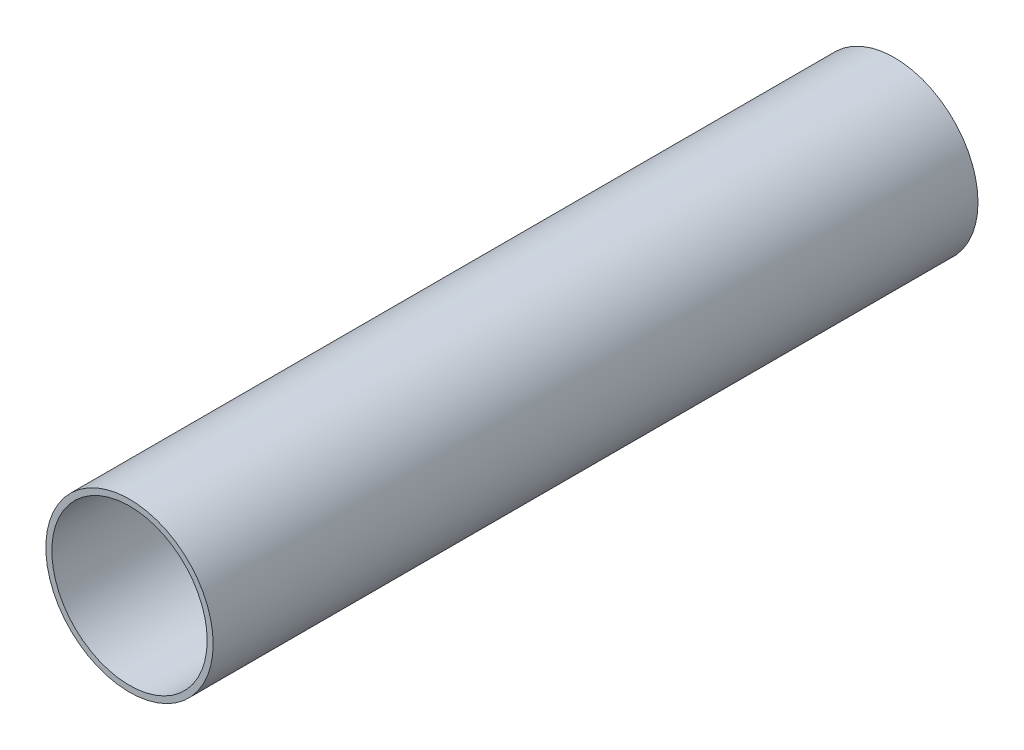
ISO-10303-21;
HEADER;
FILE_DESCRIPTION(('STEP AP214'),'2;1');
FILE_NAME('part.step','',(''),(''),'','','');
FILE_SCHEMA(('AUTOMOTIVE_DESIGN { 1 0 10303 214 1 1 1 1 }'));
ENDSEC;
DATA;
#1=APPLICATION_CONTEXT('core data for automotive mechanical design processes');
#2=APPLICATION_PROTOCOL_DEFINITION('international standard','automotive_design',2000,#1);
#3=PRODUCT_CONTEXT('',#1,'mechanical');
#4=PRODUCT('Part','Part','',(#3));
#5=PRODUCT_RELATED_PRODUCT_CATEGORY('part','',(#4));
#6=PRODUCT_DEFINITION_FORMATION('','',#4);
#7=PRODUCT_DEFINITION_CONTEXT('part definition',#1,'design');
#8=PRODUCT_DEFINITION('design','',#6,#7);
#9=PRODUCT_DEFINITION_SHAPE('','',#8);
#10=(LENGTH_UNIT() NAMED_UNIT(*) SI_UNIT(.MILLI.,.METRE.));
#11=(NAMED_UNIT(*) PLANE_ANGLE_UNIT() SI_UNIT($,.RADIAN.));
#12=(NAMED_UNIT(*) SI_UNIT($,.STERADIAN.) SOLID_ANGLE_UNIT());
#13=UNCERTAINTY_MEASURE_WITH_UNIT(LENGTH_MEASURE(1.E-05),#10,'distance_accuracy_value','');
#14=(GEOMETRIC_REPRESENTATION_CONTEXT(3) GLOBAL_UNCERTAINTY_ASSIGNED_CONTEXT((#13)) GLOBAL_UNIT_ASSIGNED_CONTEXT((#10,
#11,#12)) REPRESENTATION_CONTEXT('',''));
#15=CARTESIAN_POINT('',(0.,0.,0.));
#16=DIRECTION('',(0.,0.,1.));
#17=DIRECTION('',(1.,0.,0.));
#18=AXIS2_PLACEMENT_3D('',#15,#16,#17);
#19=CARTESIAN_POINT('',(0.,0.,168.656));
#20=DIRECTION('',(0.,0.,1.));
#21=DIRECTION('',(1.,0.,0.));
#22=AXIS2_PLACEMENT_3D('',#19,#20,#21);
#23=PLANE('',#22);
#24=CARTESIAN_POINT('',(0.,0.,168.656));
#25=DIRECTION('',(0.,0.,1.));
#26=DIRECTION('',(1.,0.,0.));
#27=AXIS2_PLACEMENT_3D('',#24,#25,#26);
#28=CIRCLE('',#27,14.6685);
#29=CARTESIAN_POINT('',(14.6685,0.,168.656));
#30=VERTEX_POINT('',#29);
#31=EDGE_CURVE('E10',#30,#30,#28,.T.);
#32=ORIENTED_EDGE('',*,*,#31,.T.);
#33=EDGE_LOOP('',(#32));
#34=FACE_BOUND('',#33,.T.);
#35=CARTESIAN_POINT('',(0.,0.,168.656));
#36=DIRECTION('',(0.,0.,1.));
#37=DIRECTION('',(1.,0.,0.));
#38=AXIS2_PLACEMENT_3D('',#35,#36,#37);
#39=CIRCLE('',#38,13.62075);
#40=CARTESIAN_POINT('',(13.62075,0.,168.656));
#41=VERTEX_POINT('',#40);
#42=EDGE_CURVE('E49',#41,#41,#39,.T.);
#43=ORIENTED_EDGE('',*,*,#42,.F.);
#44=EDGE_LOOP('',(#43));
#45=FACE_BOUND('',#44,.T.);
#46=ADVANCED_FACE('F36',(#34,#45),#23,.T.);
#47=CARTESIAN_POINT('',(0.,0.,34.544));
#48=DIRECTION('',(0.,0.,1.));
#49=DIRECTION('',(1.,0.,0.));
#50=AXIS2_PLACEMENT_3D('',#47,#48,#49);
#51=PLANE('',#50);
#52=CARTESIAN_POINT('',(0.,0.,34.544));
#53=DIRECTION('',(0.,0.,1.));
#54=DIRECTION('',(1.,0.,0.));
#55=AXIS2_PLACEMENT_3D('',#52,#53,#54);
#56=CIRCLE('',#55,14.6685);
#57=CARTESIAN_POINT('',(14.6685,0.,34.544));
#58=VERTEX_POINT('',#57);
#59=EDGE_CURVE('E40',#58,#58,#56,.T.);
#60=ORIENTED_EDGE('',*,*,#59,.F.);
#61=EDGE_LOOP('',(#60));
#62=FACE_BOUND('',#61,.T.);
#63=CARTESIAN_POINT('',(0.,0.,34.544));
#64=DIRECTION('',(0.,0.,1.));
#65=DIRECTION('',(1.,0.,0.));
#66=AXIS2_PLACEMENT_3D('',#63,#64,#65);
#67=CIRCLE('',#66,13.62075);
#68=CARTESIAN_POINT('',(13.62075,0.,34.544));
#69=VERTEX_POINT('',#68);
#70=EDGE_CURVE('E51',#69,#69,#67,.T.);
#71=ORIENTED_EDGE('',*,*,#70,.T.);
#72=EDGE_LOOP('',(#71));
#73=FACE_BOUND('',#72,.T.);
#74=ADVANCED_FACE('F63',(#62,#73),#51,.F.);
#75=CARTESIAN_POINT('',(0.,0.,168.656));
#76=DIRECTION('',(0.,0.,-1.));
#77=DIRECTION('',(-1.,0.,0.));
#78=AXIS2_PLACEMENT_3D('',#75,#76,#77);
#79=CYLINDRICAL_SURFACE('',#78,14.6685);
#80=ORIENTED_EDGE('',*,*,#31,.F.);
#81=EDGE_LOOP('',(#80));
#82=FACE_BOUND('',#81,.T.);
#83=ORIENTED_EDGE('',*,*,#59,.T.);
#84=EDGE_LOOP('',(#83));
#85=FACE_BOUND('',#84,.T.);
#86=ADVANCED_FACE('F38',(#82,#85),#79,.T.);
#87=CARTESIAN_POINT('',(0.,0.,168.656));
#88=DIRECTION('',(0.,0.,-1.));
#89=DIRECTION('',(-1.,0.,0.));
#90=AXIS2_PLACEMENT_3D('',#87,#88,#89);
#91=CYLINDRICAL_SURFACE('',#90,13.62075);
#92=ORIENTED_EDGE('',*,*,#42,.T.);
#93=EDGE_LOOP('',(#92));
#94=FACE_BOUND('',#93,.T.);
#95=ORIENTED_EDGE('',*,*,#70,.F.);
#96=EDGE_LOOP('',(#95));
#97=FACE_BOUND('',#96,.T.);
#98=ADVANCED_FACE('F59',(#94,#97),#91,.F.);
#99=CLOSED_SHELL('',(#46,#74,#86,#98));
#100=MANIFOLD_SOLID_BREP('B2',#99);
#101=ADVANCED_BREP_SHAPE_REPRESENTATION('',(#18,#100),#14);
#102=SHAPE_DEFINITION_REPRESENTATION(#9,#101);
ENDSEC;
END-ISO-10303-21;
